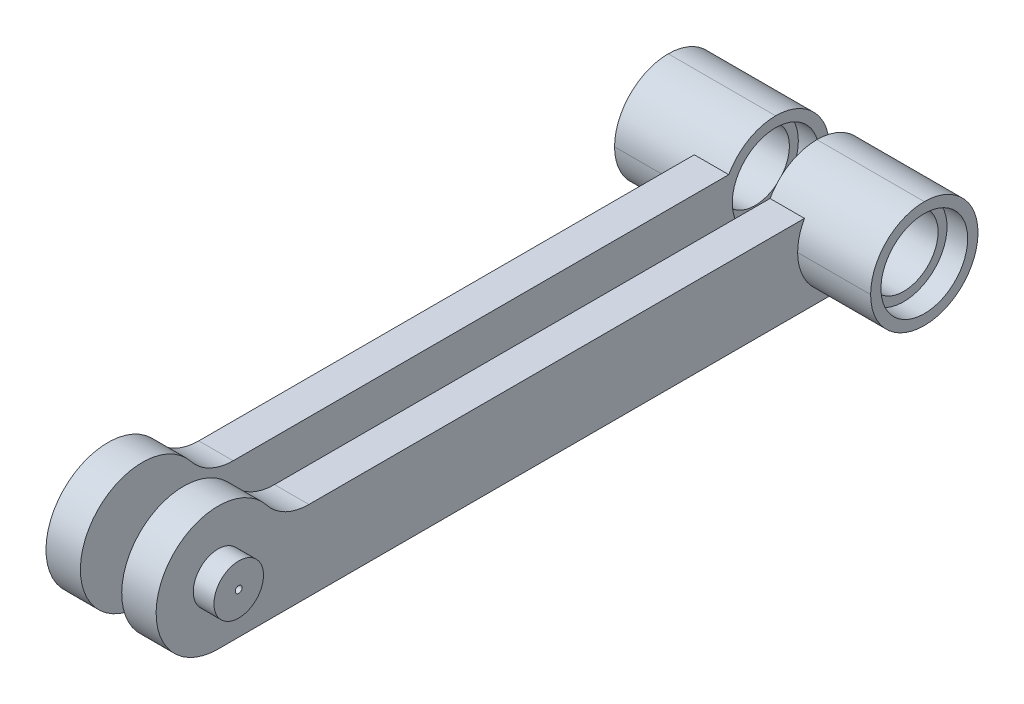
ISO-10303-21;
HEADER;
FILE_DESCRIPTION(('STEP AP214'),'2;1');
FILE_NAME('part.step','',(''),(''),'','','');
FILE_SCHEMA(('AUTOMOTIVE_DESIGN { 1 0 10303 214 1 1 1 1 }'));
ENDSEC;
DATA;
#1=APPLICATION_CONTEXT('core data for automotive mechanical design processes');
#2=APPLICATION_PROTOCOL_DEFINITION('international standard','automotive_design',2000,#1);
#3=PRODUCT_CONTEXT('',#1,'mechanical');
#4=PRODUCT('Part','Part','',(#3));
#5=PRODUCT_RELATED_PRODUCT_CATEGORY('part','',(#4));
#6=PRODUCT_DEFINITION_FORMATION('','',#4);
#7=PRODUCT_DEFINITION_CONTEXT('part definition',#1,'design');
#8=PRODUCT_DEFINITION('design','',#6,#7);
#9=PRODUCT_DEFINITION_SHAPE('','',#8);
#10=(LENGTH_UNIT() NAMED_UNIT(*) SI_UNIT(.MILLI.,.METRE.));
#11=(NAMED_UNIT(*) PLANE_ANGLE_UNIT() SI_UNIT($,.RADIAN.));
#12=(NAMED_UNIT(*) SI_UNIT($,.STERADIAN.) SOLID_ANGLE_UNIT());
#13=UNCERTAINTY_MEASURE_WITH_UNIT(LENGTH_MEASURE(1.E-05),#10,'distance_accuracy_value','');
#14=(GEOMETRIC_REPRESENTATION_CONTEXT(3) GLOBAL_UNCERTAINTY_ASSIGNED_CONTEXT((#13)) GLOBAL_UNIT_ASSIGNED_CONTEXT((#10,
#11,#12)) REPRESENTATION_CONTEXT('',''));
#15=CARTESIAN_POINT('',(0.,0.,0.));
#16=DIRECTION('',(0.,0.,1.));
#17=DIRECTION('',(1.,0.,0.));
#18=AXIS2_PLACEMENT_3D('',#15,#16,#17);
#19=CARTESIAN_POINT('',(-3.,0.,0.));
#20=DIRECTION('',(-1.,0.,0.));
#21=DIRECTION('',(0.,0.,-1.));
#22=AXIS2_PLACEMENT_3D('',#19,#20,#21);
#23=PLANE('',#22);
#24=CARTESIAN_POINT('',(-3.,-0.6,-46.));
#25=DIRECTION('',(1.,0.,0.));
#26=DIRECTION('',(0.,0.,-1.));
#27=AXIS2_PLACEMENT_3D('',#24,#25,#26);
#28=CIRCLE('',#27,3.15);
#29=CARTESIAN_POINT('',(-3.,-0.6,-49.15));
#30=VERTEX_POINT('',#29);
#31=EDGE_CURVE('E228',#30,#30,#28,.T.);
#32=ORIENTED_EDGE('',*,*,#31,.F.);
#33=EDGE_LOOP('',(#32));
#34=FACE_BOUND('',#33,.T.);
#35=DIRECTION('',(0.,0.,1.));
#36=VECTOR('',#35,1.);
#37=CARTESIAN_POINT('',(-3.,1.3,0.));
#38=LINE('',#37,#36);
#39=CARTESIAN_POINT('',(-3.,1.3,-42.5941227268147));
#40=VERTEX_POINT('',#39);
#41=CARTESIAN_POINT('',(-3.,1.3,-6.59696900098826));
#42=VERTEX_POINT('',#41);
#43=EDGE_CURVE('E214',#40,#42,#38,.T.);
#44=ORIENTED_EDGE('',*,*,#43,.T.);
#45=CARTESIAN_POINT('',(-3.,5.2,-6.59696900098826));
#46=DIRECTION('',(1.,0.,0.));
#47=DIRECTION('',(0.,0.,-1.));
#48=AXIS2_PLACEMENT_3D('',#45,#46,#47);
#49=CIRCLE('',#48,3.9);
#50=CARTESIAN_POINT('',(-3.,2.78571428571429,-3.53409053624371));
#51=VERTEX_POINT('',#50);
#52=EDGE_CURVE('E171',#51,#42,#49,.T.);
#53=ORIENTED_EDGE('',*,*,#52,.F.);
#54=CARTESIAN_POINT('',(-3.,0.,0.));
#55=DIRECTION('',(1.,0.,0.));
#56=DIRECTION('',(0.,0.,-1.));
#57=AXIS2_PLACEMENT_3D('',#54,#55,#56);
#58=CIRCLE('',#57,4.5);
#59=CARTESIAN_POINT('',(-3.,-4.5,0.));
#60=VERTEX_POINT('',#59);
#61=EDGE_CURVE('E149',#51,#60,#58,.T.);
#62=ORIENTED_EDGE('',*,*,#61,.T.);
#63=DIRECTION('',(0.,0.,-1.));
#64=VECTOR('',#63,1.);
#65=CARTESIAN_POINT('',(-3.,-4.5,0.));
#66=LINE('',#65,#64);
#67=CARTESIAN_POINT('',(-3.,-4.5,-46.));
#68=VERTEX_POINT('',#67);
#69=EDGE_CURVE('E159',#60,#68,#66,.T.);
#70=ORIENTED_EDGE('',*,*,#69,.T.);
#71=CARTESIAN_POINT('',(-3.,-0.6,-46.));
#72=DIRECTION('',(1.,0.,0.));
#73=DIRECTION('',(0.,0.,-1.));
#74=AXIS2_PLACEMENT_3D('',#71,#72,#73);
#75=CIRCLE('',#74,3.9);
#76=CARTESIAN_POINT('',(-3.,-0.6,-49.9));
#77=VERTEX_POINT('',#76);
#78=EDGE_CURVE('E198',#77,#68,#75,.F.);
#79=ORIENTED_EDGE('',*,*,#78,.F.);
#80=CARTESIAN_POINT('',(-3.,-0.6,-46.));
#81=DIRECTION('',(1.,0.,0.));
#82=DIRECTION('',(0.,0.,-1.));
#83=AXIS2_PLACEMENT_3D('',#80,#81,#82);
#84=CIRCLE('',#83,3.9);
#85=CARTESIAN_POINT('',(-3.,3.3,-46.));
#86=VERTEX_POINT('',#85);
#87=EDGE_CURVE('E195',#86,#77,#84,.F.);
#88=ORIENTED_EDGE('',*,*,#87,.F.);
#89=CARTESIAN_POINT('',(-3.,-0.6,-46.));
#90=DIRECTION('',(1.,0.,0.));
#91=DIRECTION('',(0.,0.,-1.));
#92=AXIS2_PLACEMENT_3D('',#89,#90,#91);
#93=CIRCLE('',#92,3.9);
#94=EDGE_CURVE('E200',#40,#86,#93,.F.);
#95=ORIENTED_EDGE('',*,*,#94,.F.);
#96=EDGE_LOOP('',(#44,#53,#62,#70,#79,#88,#95));
#97=FACE_BOUND('',#96,.T.);
#98=ADVANCED_FACE('F76',(#34,#97),#23,.F.);
#99=CARTESIAN_POINT('',(-5.5,0.,0.));
#100=DIRECTION('',(-1.,0.,0.));
#101=DIRECTION('',(0.,0.,-1.));
#102=AXIS2_PLACEMENT_3D('',#99,#100,#101);
#103=PLANE('',#102);
#104=CARTESIAN_POINT('',(-5.5,0.,0.));
#105=DIRECTION('',(1.,0.,0.));
#106=DIRECTION('',(0.,0.,-1.));
#107=AXIS2_PLACEMENT_3D('',#104,#105,#106);
#108=CIRCLE('',#107,1.8);
#109=CARTESIAN_POINT('',(-5.5,0.,-1.8));
#110=VERTEX_POINT('',#109);
#111=EDGE_CURVE('E242',#110,#110,#108,.T.);
#112=ORIENTED_EDGE('',*,*,#111,.T.);
#113=EDGE_LOOP('',(#112));
#114=FACE_BOUND('',#113,.T.);
#115=DIRECTION('',(0.,0.,-1.));
#116=VECTOR('',#115,1.);
#117=CARTESIAN_POINT('',(-5.5,1.3,0.));
#118=LINE('',#117,#116);
#119=CARTESIAN_POINT('',(-5.5,1.3,-6.59696900098826));
#120=VERTEX_POINT('',#119);
#121=CARTESIAN_POINT('',(-5.5,1.3,-42.5941227268147));
#122=VERTEX_POINT('',#121);
#123=EDGE_CURVE('E215',#120,#122,#118,.T.);
#124=ORIENTED_EDGE('',*,*,#123,.T.);
#125=CARTESIAN_POINT('',(-5.5,-0.6,-46.));
#126=DIRECTION('',(1.,0.,0.));
#127=DIRECTION('',(0.,0.,-1.));
#128=AXIS2_PLACEMENT_3D('',#125,#126,#127);
#129=CIRCLE('',#128,3.9);
#130=CARTESIAN_POINT('',(-5.5,-0.6,-42.1));
#131=VERTEX_POINT('',#130);
#132=EDGE_CURVE('E85',#131,#122,#129,.F.);
#133=ORIENTED_EDGE('',*,*,#132,.F.);
#134=CARTESIAN_POINT('',(-5.5,-0.6,-46.));
#135=DIRECTION('',(1.,0.,0.));
#136=DIRECTION('',(0.,0.,-1.));
#137=AXIS2_PLACEMENT_3D('',#134,#135,#136);
#138=CIRCLE('',#137,3.9);
#139=CARTESIAN_POINT('',(-5.5,-4.5,-46.));
#140=VERTEX_POINT('',#139);
#141=EDGE_CURVE('E207',#140,#131,#138,.F.);
#142=ORIENTED_EDGE('',*,*,#141,.F.);
#143=DIRECTION('',(0.,0.,-1.));
#144=VECTOR('',#143,1.);
#145=CARTESIAN_POINT('',(-5.5,-4.5,0.));
#146=LINE('',#145,#144);
#147=CARTESIAN_POINT('',(-5.5,-4.5,0.));
#148=VERTEX_POINT('',#147);
#149=EDGE_CURVE('E166',#148,#140,#146,.T.);
#150=ORIENTED_EDGE('',*,*,#149,.F.);
#151=CARTESIAN_POINT('',(-5.5,0.,0.));
#152=DIRECTION('',(1.,0.,0.));
#153=DIRECTION('',(0.,0.,-1.));
#154=AXIS2_PLACEMENT_3D('',#151,#152,#153);
#155=CIRCLE('',#154,4.5);
#156=CARTESIAN_POINT('',(-5.5,2.78571428571429,-3.53409053624371));
#157=VERTEX_POINT('',#156);
#158=EDGE_CURVE('E152',#157,#148,#155,.T.);
#159=ORIENTED_EDGE('',*,*,#158,.F.);
#160=CARTESIAN_POINT('',(-5.5,5.2,-6.59696900098826));
#161=DIRECTION('',(1.,0.,0.));
#162=DIRECTION('',(0.,0.,-1.));
#163=AXIS2_PLACEMENT_3D('',#160,#161,#162);
#164=CIRCLE('',#163,3.9);
#165=EDGE_CURVE('E204',#120,#157,#164,.F.);
#166=ORIENTED_EDGE('',*,*,#165,.F.);
#167=EDGE_LOOP('',(#124,#133,#142,#150,#159,#166));
#168=FACE_BOUND('',#167,.T.);
#169=ADVANCED_FACE('F247',(#114,#168),#103,.T.);
#170=CARTESIAN_POINT('',(-10.8,-0.6,-46.));
#171=DIRECTION('',(1.,0.,0.));
#172=DIRECTION('',(0.,0.,1.));
#173=AXIS2_PLACEMENT_3D('',#170,#171,#172);
#174=CYLINDRICAL_SURFACE('',#173,2.5);
#175=CARTESIAN_POINT('',(-4.5,-0.6,-46.));
#176=DIRECTION('',(1.,0.,0.));
#177=DIRECTION('',(0.,0.,-1.));
#178=AXIS2_PLACEMENT_3D('',#175,#176,#177);
#179=CIRCLE('',#178,2.5);
#180=CARTESIAN_POINT('',(-4.5,-0.6,-48.5));
#181=VERTEX_POINT('',#180);
#182=EDGE_CURVE('E231',#181,#181,#179,.T.);
#183=ORIENTED_EDGE('',*,*,#182,.T.);
#184=EDGE_LOOP('',(#183));
#185=FACE_BOUND('',#184,.T.);
#186=CARTESIAN_POINT('',(-9.3,-0.6,-46.));
#187=DIRECTION('',(1.,0.,0.));
#188=DIRECTION('',(0.,0.,-1.));
#189=AXIS2_PLACEMENT_3D('',#186,#187,#188);
#190=CIRCLE('',#189,2.5);
#191=CARTESIAN_POINT('',(-9.3,-0.6,-48.5));
#192=VERTEX_POINT('',#191);
#193=EDGE_CURVE('E219',#192,#192,#190,.T.);
#194=ORIENTED_EDGE('',*,*,#193,.F.);
#195=EDGE_LOOP('',(#194));
#196=FACE_BOUND('',#195,.T.);
#197=ADVANCED_FACE('F272',(#185,#196),#174,.F.);
#198=CARTESIAN_POINT('',(-5.5,0.,0.));
#199=DIRECTION('',(1.,0.,0.));
#200=DIRECTION('',(0.,0.,1.));
#201=AXIS2_PLACEMENT_3D('',#198,#199,#200);
#202=CYLINDRICAL_SURFACE('',#201,4.5);
#203=ORIENTED_EDGE('',*,*,#158,.T.);
#204=DIRECTION('',(1.,0.,0.));
#205=VECTOR('',#204,1.);
#206=CARTESIAN_POINT('',(-5.5,-4.5,0.));
#207=LINE('',#206,#205);
#208=EDGE_CURVE('E145',#148,#60,#207,.T.);
#209=ORIENTED_EDGE('',*,*,#208,.T.);
#210=ORIENTED_EDGE('',*,*,#61,.F.);
#211=DIRECTION('',(1.,0.,0.));
#212=VECTOR('',#211,1.);
#213=CARTESIAN_POINT('',(-5.5,2.78571428571429,-3.53409053624371));
#214=LINE('',#213,#212);
#215=EDGE_CURVE('E179',#157,#51,#214,.T.);
#216=ORIENTED_EDGE('',*,*,#215,.F.);
#217=EDGE_LOOP('',(#203,#209,#210,#216));
#218=FACE_BOUND('',#217,.T.);
#219=ADVANCED_FACE('F147',(#218),#202,.T.);
#220=CARTESIAN_POINT('',(-5.5,-4.5,0.));
#221=DIRECTION('',(0.,1.,0.));
#222=DIRECTION('',(0.,0.,1.));
#223=AXIS2_PLACEMENT_3D('',#220,#221,#222);
#224=PLANE('',#223);
#225=DIRECTION('',(1.,0.,0.));
#226=VECTOR('',#225,1.);
#227=CARTESIAN_POINT('',(-5.5,-4.5,-46.));
#228=LINE('',#227,#226);
#229=EDGE_CURVE('E162',#68,#140,#228,.F.);
#230=ORIENTED_EDGE('',*,*,#229,.F.);
#231=ORIENTED_EDGE('',*,*,#69,.F.);
#232=ORIENTED_EDGE('',*,*,#208,.F.);
#233=ORIENTED_EDGE('',*,*,#149,.T.);
#234=EDGE_LOOP('',(#230,#231,#232,#233));
#235=FACE_BOUND('',#234,.T.);
#236=ADVANCED_FACE('F160',(#235),#224,.F.);
#237=CARTESIAN_POINT('',(-7.,0.,0.));
#238=DIRECTION('',(-1.,0.,0.));
#239=DIRECTION('',(0.,0.,-1.));
#240=AXIS2_PLACEMENT_3D('',#237,#238,#239);
#241=PLANE('',#240);
#242=CARTESIAN_POINT('',(-7.,0.,0.));
#243=DIRECTION('',(1.,0.,0.));
#244=DIRECTION('',(0.,0.,-1.));
#245=AXIS2_PLACEMENT_3D('',#242,#243,#244);
#246=CIRCLE('',#245,1.8);
#247=CARTESIAN_POINT('',(-7.,0.,-1.8));
#248=VERTEX_POINT('',#247);
#249=EDGE_CURVE('E167',#248,#248,#246,.T.);
#250=ORIENTED_EDGE('',*,*,#249,.F.);
#251=EDGE_LOOP('',(#250));
#252=FACE_BOUND('',#251,.T.);
#253=CARTESIAN_POINT('',(-7.,0.,0.));
#254=DIRECTION('',(1.,0.,0.));
#255=DIRECTION('',(0.,0.,-1.));
#256=AXIS2_PLACEMENT_3D('',#253,#254,#255);
#257=CIRCLE('',#256,0.25);
#258=CARTESIAN_POINT('',(-7.,0.,-0.25));
#259=VERTEX_POINT('',#258);
#260=EDGE_CURVE('E237',#259,#259,#257,.T.);
#261=ORIENTED_EDGE('',*,*,#260,.T.);
#262=EDGE_LOOP('',(#261));
#263=FACE_BOUND('',#262,.T.);
#264=ADVANCED_FACE('F253',(#252,#263),#241,.T.);
#265=CARTESIAN_POINT('',(-7.,0.,0.));
#266=DIRECTION('',(1.,0.,0.));
#267=DIRECTION('',(0.,0.,1.));
#268=AXIS2_PLACEMENT_3D('',#265,#266,#267);
#269=CYLINDRICAL_SURFACE('',#268,1.8);
#270=ORIENTED_EDGE('',*,*,#249,.T.);
#271=EDGE_LOOP('',(#270));
#272=FACE_BOUND('',#271,.T.);
#273=ORIENTED_EDGE('',*,*,#111,.F.);
#274=EDGE_LOOP('',(#273));
#275=FACE_BOUND('',#274,.T.);
#276=ADVANCED_FACE('F250',(#272,#275),#269,.T.);
#277=CARTESIAN_POINT('',(-7.,0.,0.));
#278=DIRECTION('',(1.,0.,0.));
#279=DIRECTION('',(0.,0.,1.));
#280=AXIS2_PLACEMENT_3D('',#277,#278,#279);
#281=CYLINDRICAL_SURFACE('',#280,0.25);
#282=ORIENTED_EDGE('',*,*,#260,.F.);
#283=EDGE_LOOP('',(#282));
#284=FACE_BOUND('',#283,.T.);
#285=CARTESIAN_POINT('',(-5.5,0.,0.));
#286=DIRECTION('',(1.,0.,0.));
#287=DIRECTION('',(0.,0.,-1.));
#288=AXIS2_PLACEMENT_3D('',#285,#286,#287);
#289=CIRCLE('',#288,0.25);
#290=CARTESIAN_POINT('',(-5.5,0.,-0.25));
#291=VERTEX_POINT('',#290);
#292=EDGE_CURVE('E156',#291,#291,#289,.F.);
#293=ORIENTED_EDGE('',*,*,#292,.F.);
#294=EDGE_LOOP('',(#293));
#295=FACE_BOUND('',#294,.T.);
#296=ADVANCED_FACE('F252',(#284,#295),#281,.F.);
#297=ORIENTED_EDGE('',*,*,#292,.T.);
#298=EDGE_LOOP('',(#297));
#299=FACE_BOUND('',#298,.T.);
#300=ADVANCED_FACE('F260',(#299),#103,.T.);
#301=CARTESIAN_POINT('',(-10.8,0.,0.));
#302=DIRECTION('',(-1.,0.,0.));
#303=DIRECTION('',(0.,0.,-1.));
#304=AXIS2_PLACEMENT_3D('',#301,#302,#303);
#305=PLANE('',#304);
#306=CARTESIAN_POINT('',(-10.8,-0.6,-46.));
#307=DIRECTION('',(1.,0.,0.));
#308=DIRECTION('',(0.,0.,-1.));
#309=AXIS2_PLACEMENT_3D('',#306,#307,#308);
#310=CIRCLE('',#309,3.15);
#311=CARTESIAN_POINT('',(-10.8,-0.6,-49.15));
#312=VERTEX_POINT('',#311);
#313=EDGE_CURVE('E224',#312,#312,#310,.T.);
#314=ORIENTED_EDGE('',*,*,#313,.T.);
#315=EDGE_LOOP('',(#314));
#316=FACE_BOUND('',#315,.T.);
#317=CARTESIAN_POINT('',(-10.8,-0.6,-46.));
#318=DIRECTION('',(1.,0.,0.));
#319=DIRECTION('',(0.,0.,-1.));
#320=AXIS2_PLACEMENT_3D('',#317,#318,#319);
#321=CIRCLE('',#320,3.9);
#322=CARTESIAN_POINT('',(-10.8,3.3,-46.));
#323=VERTEX_POINT('',#322);
#324=CARTESIAN_POINT('',(-10.8,-0.6,-42.1));
#325=VERTEX_POINT('',#324);
#326=EDGE_CURVE('E190',#323,#325,#321,.T.);
#327=ORIENTED_EDGE('',*,*,#326,.F.);
#328=CARTESIAN_POINT('',(-10.8,-0.6,-46.));
#329=DIRECTION('',(1.,0.,0.));
#330=DIRECTION('',(0.,0.,-1.));
#331=AXIS2_PLACEMENT_3D('',#328,#329,#330);
#332=CIRCLE('',#331,3.9);
#333=CARTESIAN_POINT('',(-10.8,-0.6,-49.9));
#334=VERTEX_POINT('',#333);
#335=EDGE_CURVE('E184',#334,#323,#332,.T.);
#336=ORIENTED_EDGE('',*,*,#335,.F.);
#337=CARTESIAN_POINT('',(-10.8,-0.6,-46.));
#338=DIRECTION('',(1.,0.,0.));
#339=DIRECTION('',(0.,0.,-1.));
#340=AXIS2_PLACEMENT_3D('',#337,#338,#339);
#341=CIRCLE('',#340,3.9);
#342=CARTESIAN_POINT('',(-10.8,-4.5,-46.));
#343=VERTEX_POINT('',#342);
#344=EDGE_CURVE('E187',#343,#334,#341,.T.);
#345=ORIENTED_EDGE('',*,*,#344,.F.);
#346=CARTESIAN_POINT('',(-10.8,-0.6,-46.));
#347=DIRECTION('',(1.,0.,0.));
#348=DIRECTION('',(0.,0.,-1.));
#349=AXIS2_PLACEMENT_3D('',#346,#347,#348);
#350=CIRCLE('',#349,3.9);
#351=EDGE_CURVE('E192',#325,#343,#350,.T.);
#352=ORIENTED_EDGE('',*,*,#351,.F.);
#353=EDGE_LOOP('',(#327,#336,#345,#352));
#354=FACE_BOUND('',#353,.T.);
#355=ADVANCED_FACE('F305',(#316,#354),#305,.T.);
#356=CARTESIAN_POINT('',(-4.5,-0.6,-46.));
#357=DIRECTION('',(1.,0.,0.));
#358=DIRECTION('',(0.,0.,1.));
#359=AXIS2_PLACEMENT_3D('',#356,#357,#358);
#360=CYLINDRICAL_SURFACE('',#359,3.15);
#361=CARTESIAN_POINT('',(-4.5,-0.6,-46.));
#362=DIRECTION('',(1.,0.,0.));
#363=DIRECTION('',(0.,0.,-1.));
#364=AXIS2_PLACEMENT_3D('',#361,#362,#363);
#365=CIRCLE('',#364,3.15);
#366=CARTESIAN_POINT('',(-4.5,-0.6,-49.15));
#367=VERTEX_POINT('',#366);
#368=EDGE_CURVE('E234',#367,#367,#365,.T.);
#369=ORIENTED_EDGE('',*,*,#368,.F.);
#370=EDGE_LOOP('',(#369));
#371=FACE_BOUND('',#370,.T.);
#372=ORIENTED_EDGE('',*,*,#31,.T.);
#373=EDGE_LOOP('',(#372));
#374=FACE_BOUND('',#373,.T.);
#375=ADVANCED_FACE('F307',(#371,#374),#360,.F.);
#376=CARTESIAN_POINT('',(-4.5,0.,0.));
#377=DIRECTION('',(-1.,0.,0.));
#378=DIRECTION('',(0.,0.,-1.));
#379=AXIS2_PLACEMENT_3D('',#376,#377,#378);
#380=PLANE('',#379);
#381=ORIENTED_EDGE('',*,*,#182,.F.);
#382=EDGE_LOOP('',(#381));
#383=FACE_BOUND('',#382,.T.);
#384=ORIENTED_EDGE('',*,*,#368,.T.);
#385=EDGE_LOOP('',(#384));
#386=FACE_BOUND('',#385,.T.);
#387=ADVANCED_FACE('F314',(#383,#386),#380,.F.);
#388=CARTESIAN_POINT('',(-9.3,-0.6,-46.));
#389=DIRECTION('',(-1.,0.,0.));
#390=DIRECTION('',(0.,0.,-1.));
#391=AXIS2_PLACEMENT_3D('',#388,#389,#390);
#392=CYLINDRICAL_SURFACE('',#391,3.15);
#393=CARTESIAN_POINT('',(-9.3,-0.6,-46.));
#394=DIRECTION('',(1.,0.,0.));
#395=DIRECTION('',(0.,0.,-1.));
#396=AXIS2_PLACEMENT_3D('',#393,#394,#395);
#397=CIRCLE('',#396,3.15);
#398=CARTESIAN_POINT('',(-9.3,-0.6,-49.15));
#399=VERTEX_POINT('',#398);
#400=EDGE_CURVE('E225',#399,#399,#397,.T.);
#401=ORIENTED_EDGE('',*,*,#400,.T.);
#402=EDGE_LOOP('',(#401));
#403=FACE_BOUND('',#402,.T.);
#404=ORIENTED_EDGE('',*,*,#313,.F.);
#405=EDGE_LOOP('',(#404));
#406=FACE_BOUND('',#405,.T.);
#407=ADVANCED_FACE('F324',(#403,#406),#392,.F.);
#408=CARTESIAN_POINT('',(-9.3,-0.6,-46.));
#409=DIRECTION('',(-1.,0.,0.));
#410=DIRECTION('',(0.,0.,-1.));
#411=AXIS2_PLACEMENT_3D('',#408,#409,#410);
#412=PLANE('',#411);
#413=ORIENTED_EDGE('',*,*,#193,.T.);
#414=EDGE_LOOP('',(#413));
#415=FACE_BOUND('',#414,.T.);
#416=ORIENTED_EDGE('',*,*,#400,.F.);
#417=EDGE_LOOP('',(#416));
#418=FACE_BOUND('',#417,.T.);
#419=ADVANCED_FACE('F328',(#415,#418),#412,.T.);
#420=CARTESIAN_POINT('',(-10.8,1.3,0.));
#421=DIRECTION('',(0.,-1.,0.));
#422=DIRECTION('',(0.,0.,-1.));
#423=AXIS2_PLACEMENT_3D('',#420,#421,#422);
#424=PLANE('',#423);
#425=ORIENTED_EDGE('',*,*,#43,.F.);
#426=DIRECTION('',(1.,0.,0.));
#427=VECTOR('',#426,1.);
#428=CARTESIAN_POINT('',(-5.5,1.3,-42.5941227268147));
#429=LINE('',#428,#427);
#430=EDGE_CURVE('E13',#122,#40,#429,.T.);
#431=ORIENTED_EDGE('',*,*,#430,.F.);
#432=ORIENTED_EDGE('',*,*,#123,.F.);
#433=DIRECTION('',(-1.,0.,0.));
#434=VECTOR('',#433,1.);
#435=CARTESIAN_POINT('',(-5.5,1.3,-6.59696900098826));
#436=LINE('',#435,#434);
#437=EDGE_CURVE('E181',#42,#120,#436,.T.);
#438=ORIENTED_EDGE('',*,*,#437,.F.);
#439=EDGE_LOOP('',(#425,#431,#432,#438));
#440=FACE_BOUND('',#439,.T.);
#441=ADVANCED_FACE('F282',(#440),#424,.F.);
#442=CARTESIAN_POINT('',(-5.5,5.2,-6.59696900098826));
#443=DIRECTION('',(1.,0.,0.));
#444=DIRECTION('',(0.,0.,1.));
#445=AXIS2_PLACEMENT_3D('',#442,#443,#444);
#446=CYLINDRICAL_SURFACE('',#445,3.9);
#447=ORIENTED_EDGE('',*,*,#165,.T.);
#448=ORIENTED_EDGE('',*,*,#215,.T.);
#449=ORIENTED_EDGE('',*,*,#52,.T.);
#450=ORIENTED_EDGE('',*,*,#437,.T.);
#451=EDGE_LOOP('',(#447,#448,#449,#450));
#452=FACE_BOUND('',#451,.T.);
#453=ADVANCED_FACE('F279',(#452),#446,.F.);
#454=CARTESIAN_POINT('',(-5.5,-0.6,-46.));
#455=DIRECTION('',(-1.,0.,0.));
#456=DIRECTION('',(0.,0.,-1.));
#457=AXIS2_PLACEMENT_3D('',#454,#455,#456);
#458=CYLINDRICAL_SURFACE('',#457,3.9);
#459=DIRECTION('',(1.,0.,0.));
#460=VECTOR('',#459,1.);
#461=CARTESIAN_POINT('',(-10.8,-0.6,-49.9));
#462=LINE('',#461,#460);
#463=EDGE_CURVE('E212',#77,#334,#462,.F.);
#464=ORIENTED_EDGE('',*,*,#463,.T.);
#465=ORIENTED_EDGE('',*,*,#335,.T.);
#466=DIRECTION('',(1.,0.,0.));
#467=VECTOR('',#466,1.);
#468=CARTESIAN_POINT('',(-3.,3.3,-46.));
#469=LINE('',#468,#467);
#470=EDGE_CURVE('E80',#323,#86,#469,.T.);
#471=ORIENTED_EDGE('',*,*,#470,.T.);
#472=ORIENTED_EDGE('',*,*,#87,.T.);
#473=EDGE_LOOP('',(#464,#465,#471,#472));
#474=FACE_BOUND('',#473,.T.);
#475=ADVANCED_FACE('F78',(#474),#458,.T.);
#476=CARTESIAN_POINT('',(-10.8,-0.6,-46.));
#477=DIRECTION('',(1.,0.,0.));
#478=DIRECTION('',(0.,0.,1.));
#479=AXIS2_PLACEMENT_3D('',#476,#477,#478);
#480=CYLINDRICAL_SURFACE('',#479,3.9);
#481=ORIENTED_EDGE('',*,*,#430,.T.);
#482=ORIENTED_EDGE('',*,*,#94,.T.);
#483=ORIENTED_EDGE('',*,*,#470,.F.);
#484=ORIENTED_EDGE('',*,*,#326,.T.);
#485=DIRECTION('',(1.,0.,0.));
#486=VECTOR('',#485,1.);
#487=CARTESIAN_POINT('',(-10.8,-0.6,-42.1));
#488=LINE('',#487,#486);
#489=EDGE_CURVE('E98',#325,#131,#488,.T.);
#490=ORIENTED_EDGE('',*,*,#489,.T.);
#491=ORIENTED_EDGE('',*,*,#132,.T.);
#492=EDGE_LOOP('',(#481,#482,#483,#484,#490,#491));
#493=FACE_BOUND('',#492,.T.);
#494=ADVANCED_FACE('F290',(#493),#480,.T.);
#495=CARTESIAN_POINT('',(-5.5,-0.6,-46.));
#496=DIRECTION('',(1.,0.,0.));
#497=DIRECTION('',(0.,0.,1.));
#498=AXIS2_PLACEMENT_3D('',#495,#496,#497);
#499=CYLINDRICAL_SURFACE('',#498,3.9);
#500=ORIENTED_EDGE('',*,*,#463,.F.);
#501=ORIENTED_EDGE('',*,*,#78,.T.);
#502=ORIENTED_EDGE('',*,*,#229,.T.);
#503=DIRECTION('',(1.,0.,0.));
#504=VECTOR('',#503,1.);
#505=CARTESIAN_POINT('',(-5.5,-4.5,-46.));
#506=LINE('',#505,#504);
#507=EDGE_CURVE('E210',#140,#343,#506,.F.);
#508=ORIENTED_EDGE('',*,*,#507,.T.);
#509=ORIENTED_EDGE('',*,*,#344,.T.);
#510=EDGE_LOOP('',(#500,#501,#502,#508,#509));
#511=FACE_BOUND('',#510,.T.);
#512=ADVANCED_FACE('F287',(#511),#499,.T.);
#513=CARTESIAN_POINT('',(-5.5,-0.6,-46.));
#514=DIRECTION('',(-1.,0.,0.));
#515=DIRECTION('',(0.,0.,-1.));
#516=AXIS2_PLACEMENT_3D('',#513,#514,#515);
#517=CYLINDRICAL_SURFACE('',#516,3.9);
#518=ORIENTED_EDGE('',*,*,#351,.T.);
#519=ORIENTED_EDGE('',*,*,#507,.F.);
#520=ORIENTED_EDGE('',*,*,#141,.T.);
#521=ORIENTED_EDGE('',*,*,#489,.F.);
#522=EDGE_LOOP('',(#518,#519,#520,#521));
#523=FACE_BOUND('',#522,.T.);
#524=ADVANCED_FACE('F284',(#523),#517,.T.);
#525=CLOSED_SHELL('',(#98,#169,#197,#219,#236,#264,#276,#296,#300,#355,#375,#387,#407,#419,#441,
#453,#475,#494,#512,#524));
#526=MANIFOLD_SOLID_BREP('B2',#525);
#527=CARTESIAN_POINT('',(0.,0.,0.));
#528=DIRECTION('',(1.,0.,0.));
#529=DIRECTION('',(0.,0.,-1.));
#530=AXIS2_PLACEMENT_3D('',#527,#528,#529);
#531=PLANE('',#530);
#532=CARTESIAN_POINT('',(0.,-0.6,-46.));
#533=DIRECTION('',(1.,0.,0.));
#534=DIRECTION('',(0.,0.,-1.));
#535=AXIS2_PLACEMENT_3D('',#532,#533,#534);
#536=CIRCLE('',#535,3.15);
#537=CARTESIAN_POINT('',(0.,-0.6,-49.15));
#538=VERTEX_POINT('',#537);
#539=EDGE_CURVE('E638',#538,#538,#536,.T.);
#540=ORIENTED_EDGE('',*,*,#539,.T.);
#541=EDGE_LOOP('',(#540));
#542=FACE_BOUND('',#541,.T.);
#543=DIRECTION('',(0.,0.,1.));
#544=VECTOR('',#543,1.);
#545=CARTESIAN_POINT('',(0.,1.3,0.));
#546=LINE('',#545,#544);
#547=CARTESIAN_POINT('',(0.,1.3,-42.5941227268147));
#548=VERTEX_POINT('',#547);
#549=CARTESIAN_POINT('',(0.,1.3,-6.59696900098826));
#550=VERTEX_POINT('',#549);
#551=EDGE_CURVE('E621',#548,#550,#546,.T.);
#552=ORIENTED_EDGE('',*,*,#551,.F.);
#553=CARTESIAN_POINT('',(0.,-0.6,-46.));
#554=DIRECTION('',(1.,0.,0.));
#555=DIRECTION('',(0.,0.,-1.));
#556=AXIS2_PLACEMENT_3D('',#553,#554,#555);
#557=CIRCLE('',#556,3.9);
#558=CARTESIAN_POINT('',(0.,3.3,-46.));
#559=VERTEX_POINT('',#558);
#560=EDGE_CURVE('E603',#548,#559,#557,.F.);
#561=ORIENTED_EDGE('',*,*,#560,.T.);
#562=CARTESIAN_POINT('',(0.,-0.6,-46.));
#563=DIRECTION('',(1.,0.,0.));
#564=DIRECTION('',(0.,0.,-1.));
#565=AXIS2_PLACEMENT_3D('',#562,#563,#564);
#566=CIRCLE('',#565,3.9);
#567=CARTESIAN_POINT('',(0.,-0.6,-49.9));
#568=VERTEX_POINT('',#567);
#569=EDGE_CURVE('E600',#559,#568,#566,.F.);
#570=ORIENTED_EDGE('',*,*,#569,.T.);
#571=CARTESIAN_POINT('',(0.,-0.6,-46.));
#572=DIRECTION('',(1.,0.,0.));
#573=DIRECTION('',(0.,0.,-1.));
#574=AXIS2_PLACEMENT_3D('',#571,#572,#573);
#575=CIRCLE('',#574,3.9);
#576=CARTESIAN_POINT('',(0.,-4.5,-46.));
#577=VERTEX_POINT('',#576);
#578=EDGE_CURVE('E576',#568,#577,#575,.F.);
#579=ORIENTED_EDGE('',*,*,#578,.T.);
#580=DIRECTION('',(0.,0.,-1.));
#581=VECTOR('',#580,1.);
#582=CARTESIAN_POINT('',(0.,-4.5,0.));
#583=LINE('',#582,#581);
#584=CARTESIAN_POINT('',(0.,-4.5,0.));
#585=VERTEX_POINT('',#584);
#586=EDGE_CURVE('E571',#585,#577,#583,.T.);
#587=ORIENTED_EDGE('',*,*,#586,.F.);
#588=CARTESIAN_POINT('',(0.,0.,0.));
#589=DIRECTION('',(1.,0.,0.));
#590=DIRECTION('',(0.,0.,-1.));
#591=AXIS2_PLACEMENT_3D('',#588,#589,#590);
#592=CIRCLE('',#591,4.5);
#593=CARTESIAN_POINT('',(0.,2.78571428571429,-3.53409053624371));
#594=VERTEX_POINT('',#593);
#595=EDGE_CURVE('E554',#594,#585,#592,.T.);
#596=ORIENTED_EDGE('',*,*,#595,.F.);
#597=CARTESIAN_POINT('',(0.,5.2,-6.59696900098826));
#598=DIRECTION('',(1.,0.,0.));
#599=DIRECTION('',(0.,0.,-1.));
#600=AXIS2_PLACEMENT_3D('',#597,#598,#599);
#601=CIRCLE('',#600,3.9);
#602=EDGE_CURVE('E605',#594,#550,#601,.T.);
#603=ORIENTED_EDGE('',*,*,#602,.T.);
#604=EDGE_LOOP('',(#552,#561,#570,#579,#587,#596,#603));
#605=FACE_BOUND('',#604,.T.);
#606=ADVANCED_FACE('F481',(#542,#605),#531,.F.);
#607=CARTESIAN_POINT('',(2.5,0.,0.));
#608=DIRECTION('',(1.,0.,0.));
#609=DIRECTION('',(0.,0.,-1.));
#610=AXIS2_PLACEMENT_3D('',#607,#608,#609);
#611=PLANE('',#610);
#612=CARTESIAN_POINT('',(2.5,0.,0.));
#613=DIRECTION('',(1.,0.,0.));
#614=DIRECTION('',(0.,0.,-1.));
#615=AXIS2_PLACEMENT_3D('',#612,#613,#614);
#616=CIRCLE('',#615,1.8);
#617=CARTESIAN_POINT('',(2.5,0.,-1.8));
#618=VERTEX_POINT('',#617);
#619=EDGE_CURVE('E581',#618,#618,#616,.T.);
#620=ORIENTED_EDGE('',*,*,#619,.F.);
#621=EDGE_LOOP('',(#620));
#622=FACE_BOUND('',#621,.T.);
#623=DIRECTION('',(0.,0.,-1.));
#624=VECTOR('',#623,1.);
#625=CARTESIAN_POINT('',(2.5,1.3,0.));
#626=LINE('',#625,#624);
#627=CARTESIAN_POINT('',(2.5,1.3,-6.59696900098826));
#628=VERTEX_POINT('',#627);
#629=CARTESIAN_POINT('',(2.5,1.3,-42.5941227268147));
#630=VERTEX_POINT('',#629);
#631=EDGE_CURVE('E497',#628,#630,#626,.T.);
#632=ORIENTED_EDGE('',*,*,#631,.F.);
#633=CARTESIAN_POINT('',(2.5,5.2,-6.59696900098826));
#634=DIRECTION('',(1.,0.,0.));
#635=DIRECTION('',(0.,0.,-1.));
#636=AXIS2_PLACEMENT_3D('',#633,#634,#635);
#637=CIRCLE('',#636,3.9);
#638=CARTESIAN_POINT('',(2.5,2.78571428571429,-3.53409053624371));
#639=VERTEX_POINT('',#638);
#640=EDGE_CURVE('E607',#628,#639,#637,.F.);
#641=ORIENTED_EDGE('',*,*,#640,.T.);
#642=CARTESIAN_POINT('',(2.5,0.,0.));
#643=DIRECTION('',(1.,0.,0.));
#644=DIRECTION('',(0.,0.,-1.));
#645=AXIS2_PLACEMENT_3D('',#642,#643,#644);
#646=CIRCLE('',#645,4.5);
#647=CARTESIAN_POINT('',(2.5,-4.5,0.));
#648=VERTEX_POINT('',#647);
#649=EDGE_CURVE('E564',#639,#648,#646,.T.);
#650=ORIENTED_EDGE('',*,*,#649,.T.);
#651=DIRECTION('',(0.,0.,-1.));
#652=VECTOR('',#651,1.);
#653=CARTESIAN_POINT('',(2.5,-4.5,0.));
#654=LINE('',#653,#652);
#655=CARTESIAN_POINT('',(2.5,-4.5,-46.));
#656=VERTEX_POINT('',#655);
#657=EDGE_CURVE('E565',#648,#656,#654,.T.);
#658=ORIENTED_EDGE('',*,*,#657,.T.);
#659=CARTESIAN_POINT('',(2.5,-0.6,-46.));
#660=DIRECTION('',(1.,0.,0.));
#661=DIRECTION('',(0.,0.,-1.));
#662=AXIS2_PLACEMENT_3D('',#659,#660,#661);
#663=CIRCLE('',#662,3.9);
#664=CARTESIAN_POINT('',(2.5,-0.6,-42.1));
#665=VERTEX_POINT('',#664);
#666=EDGE_CURVE('E609',#656,#665,#663,.F.);
#667=ORIENTED_EDGE('',*,*,#666,.T.);
#668=CARTESIAN_POINT('',(2.5,-0.6,-46.));
#669=DIRECTION('',(1.,0.,0.));
#670=DIRECTION('',(0.,0.,-1.));
#671=AXIS2_PLACEMENT_3D('',#668,#669,#670);
#672=CIRCLE('',#671,3.9);
#673=EDGE_CURVE('E490',#665,#630,#672,.F.);
#674=ORIENTED_EDGE('',*,*,#673,.T.);
#675=EDGE_LOOP('',(#632,#641,#650,#658,#667,#674));
#676=FACE_BOUND('',#675,.T.);
#677=ADVANCED_FACE('F655',(#622,#676),#611,.T.);
#678=CARTESIAN_POINT('',(7.8,-0.6,-46.));
#679=DIRECTION('',(-1.,0.,0.));
#680=DIRECTION('',(0.,0.,1.));
#681=AXIS2_PLACEMENT_3D('',#678,#679,#680);
#682=CYLINDRICAL_SURFACE('',#681,2.5);
#683=CARTESIAN_POINT('',(1.5,-0.6,-46.));
#684=DIRECTION('',(1.,0.,0.));
#685=DIRECTION('',(0.,0.,-1.));
#686=AXIS2_PLACEMENT_3D('',#683,#684,#685);
#687=CIRCLE('',#686,2.5);
#688=CARTESIAN_POINT('',(1.5,-0.6,-48.5));
#689=VERTEX_POINT('',#688);
#690=EDGE_CURVE('E641',#689,#689,#687,.T.);
#691=ORIENTED_EDGE('',*,*,#690,.F.);
#692=EDGE_LOOP('',(#691));
#693=FACE_BOUND('',#692,.T.);
#694=CARTESIAN_POINT('',(6.3,-0.6,-46.));
#695=DIRECTION('',(1.,0.,0.));
#696=DIRECTION('',(0.,0.,-1.));
#697=AXIS2_PLACEMENT_3D('',#694,#695,#696);
#698=CIRCLE('',#697,2.5);
#699=CARTESIAN_POINT('',(6.3,-0.6,-48.5));
#700=VERTEX_POINT('',#699);
#701=EDGE_CURVE('E629',#700,#700,#698,.T.);
#702=ORIENTED_EDGE('',*,*,#701,.T.);
#703=EDGE_LOOP('',(#702));
#704=FACE_BOUND('',#703,.T.);
#705=ADVANCED_FACE('F678',(#693,#704),#682,.F.);
#706=CARTESIAN_POINT('',(2.5,0.,0.));
#707=DIRECTION('',(-1.,0.,0.));
#708=DIRECTION('',(0.,0.,1.));
#709=AXIS2_PLACEMENT_3D('',#706,#707,#708);
#710=CYLINDRICAL_SURFACE('',#709,4.5);
#711=ORIENTED_EDGE('',*,*,#649,.F.);
#712=DIRECTION('',(-1.,0.,0.));
#713=VECTOR('',#712,1.);
#714=CARTESIAN_POINT('',(2.5,2.78571428571429,-3.53409053624371));
#715=LINE('',#714,#713);
#716=EDGE_CURVE('E561',#639,#594,#715,.T.);
#717=ORIENTED_EDGE('',*,*,#716,.T.);
#718=ORIENTED_EDGE('',*,*,#595,.T.);
#719=DIRECTION('',(-1.,0.,0.));
#720=VECTOR('',#719,1.);
#721=CARTESIAN_POINT('',(2.5,-4.5,0.));
#722=LINE('',#721,#720);
#723=EDGE_CURVE('E558',#648,#585,#722,.T.);
#724=ORIENTED_EDGE('',*,*,#723,.F.);
#725=EDGE_LOOP('',(#711,#717,#718,#724));
#726=FACE_BOUND('',#725,.T.);
#727=ADVANCED_FACE('F557',(#726),#710,.T.);
#728=CARTESIAN_POINT('',(2.5,-4.5,0.));
#729=DIRECTION('',(0.,1.,0.));
#730=DIRECTION('',(0.,0.,1.));
#731=AXIS2_PLACEMENT_3D('',#728,#729,#730);
#732=PLANE('',#731);
#733=DIRECTION('',(-1.,0.,0.));
#734=VECTOR('',#733,1.);
#735=CARTESIAN_POINT('',(2.5,-4.5,-46.));
#736=LINE('',#735,#734);
#737=EDGE_CURVE('E589',#577,#656,#736,.F.);
#738=ORIENTED_EDGE('',*,*,#737,.T.);
#739=ORIENTED_EDGE('',*,*,#657,.F.);
#740=ORIENTED_EDGE('',*,*,#723,.T.);
#741=ORIENTED_EDGE('',*,*,#586,.T.);
#742=EDGE_LOOP('',(#738,#739,#740,#741));
#743=FACE_BOUND('',#742,.T.);
#744=ADVANCED_FACE('F570',(#743),#732,.F.);
#745=CARTESIAN_POINT('',(4.,0.,0.));
#746=DIRECTION('',(1.,0.,0.));
#747=DIRECTION('',(0.,0.,-1.));
#748=AXIS2_PLACEMENT_3D('',#745,#746,#747);
#749=PLANE('',#748);
#750=CARTESIAN_POINT('',(4.,0.,0.));
#751=DIRECTION('',(1.,0.,0.));
#752=DIRECTION('',(0.,0.,-1.));
#753=AXIS2_PLACEMENT_3D('',#750,#751,#752);
#754=CIRCLE('',#753,1.8);
#755=CARTESIAN_POINT('',(4.,0.,-1.8));
#756=VERTEX_POINT('',#755);
#757=EDGE_CURVE('E577',#756,#756,#754,.T.);
#758=ORIENTED_EDGE('',*,*,#757,.T.);
#759=EDGE_LOOP('',(#758));
#760=FACE_BOUND('',#759,.T.);
#761=CARTESIAN_POINT('',(4.,0.,0.));
#762=DIRECTION('',(1.,0.,0.));
#763=DIRECTION('',(0.,0.,-1.));
#764=AXIS2_PLACEMENT_3D('',#761,#762,#763);
#765=CIRCLE('',#764,0.25);
#766=CARTESIAN_POINT('',(4.,0.,-0.25));
#767=VERTEX_POINT('',#766);
#768=EDGE_CURVE('E647',#767,#767,#765,.T.);
#769=ORIENTED_EDGE('',*,*,#768,.F.);
#770=EDGE_LOOP('',(#769));
#771=FACE_BOUND('',#770,.T.);
#772=ADVANCED_FACE('F688',(#760,#771),#749,.T.);
#773=CARTESIAN_POINT('',(4.,0.,0.));
#774=DIRECTION('',(-1.,0.,0.));
#775=DIRECTION('',(0.,0.,1.));
#776=AXIS2_PLACEMENT_3D('',#773,#774,#775);
#777=CYLINDRICAL_SURFACE('',#776,1.8);
#778=ORIENTED_EDGE('',*,*,#757,.F.);
#779=EDGE_LOOP('',(#778));
#780=FACE_BOUND('',#779,.T.);
#781=ORIENTED_EDGE('',*,*,#619,.T.);
#782=EDGE_LOOP('',(#781));
#783=FACE_BOUND('',#782,.T.);
#784=ADVANCED_FACE('F716',(#780,#783),#777,.T.);
#785=CARTESIAN_POINT('',(4.,0.,0.));
#786=DIRECTION('',(-1.,0.,0.));
#787=DIRECTION('',(0.,0.,1.));
#788=AXIS2_PLACEMENT_3D('',#785,#786,#787);
#789=CYLINDRICAL_SURFACE('',#788,0.25);
#790=ORIENTED_EDGE('',*,*,#768,.T.);
#791=EDGE_LOOP('',(#790));
#792=FACE_BOUND('',#791,.T.);
#793=CARTESIAN_POINT('',(2.5,0.,0.));
#794=DIRECTION('',(1.,0.,0.));
#795=DIRECTION('',(0.,0.,-1.));
#796=AXIS2_PLACEMENT_3D('',#793,#794,#795);
#797=CIRCLE('',#796,0.25);
#798=CARTESIAN_POINT('',(2.5,0.,-0.25));
#799=VERTEX_POINT('',#798);
#800=EDGE_CURVE('E573',#799,#799,#797,.F.);
#801=ORIENTED_EDGE('',*,*,#800,.T.);
#802=EDGE_LOOP('',(#801));
#803=FACE_BOUND('',#802,.T.);
#804=ADVANCED_FACE('F709',(#792,#803),#789,.F.);
#805=ORIENTED_EDGE('',*,*,#800,.F.);
#806=EDGE_LOOP('',(#805));
#807=FACE_BOUND('',#806,.T.);
#808=ADVANCED_FACE('F681',(#807),#611,.T.);
#809=CARTESIAN_POINT('',(7.8,0.,0.));
#810=DIRECTION('',(1.,0.,0.));
#811=DIRECTION('',(0.,0.,-1.));
#812=AXIS2_PLACEMENT_3D('',#809,#810,#811);
#813=PLANE('',#812);
#814=CARTESIAN_POINT('',(7.8,-0.6,-46.));
#815=DIRECTION('',(1.,0.,0.));
#816=DIRECTION('',(0.,0.,-1.));
#817=AXIS2_PLACEMENT_3D('',#814,#815,#816);
#818=CIRCLE('',#817,3.15);
#819=CARTESIAN_POINT('',(7.8,-0.6,-49.15));
#820=VERTEX_POINT('',#819);
#821=EDGE_CURVE('E634',#820,#820,#818,.T.);
#822=ORIENTED_EDGE('',*,*,#821,.F.);
#823=EDGE_LOOP('',(#822));
#824=FACE_BOUND('',#823,.T.);
#825=CARTESIAN_POINT('',(7.8,-0.6,-46.));
#826=DIRECTION('',(1.,0.,0.));
#827=DIRECTION('',(0.,0.,-1.));
#828=AXIS2_PLACEMENT_3D('',#825,#826,#827);
#829=CIRCLE('',#828,3.9);
#830=CARTESIAN_POINT('',(7.8,3.3,-46.));
#831=VERTEX_POINT('',#830);
#832=CARTESIAN_POINT('',(7.8,-0.6,-42.1));
#833=VERTEX_POINT('',#832);
#834=EDGE_CURVE('E595',#831,#833,#829,.T.);
#835=ORIENTED_EDGE('',*,*,#834,.T.);
#836=CARTESIAN_POINT('',(7.8,-0.6,-46.));
#837=DIRECTION('',(1.,0.,0.));
#838=DIRECTION('',(0.,0.,-1.));
#839=AXIS2_PLACEMENT_3D('',#836,#837,#838);
#840=CIRCLE('',#839,3.9);
#841=CARTESIAN_POINT('',(7.8,-4.5,-46.));
#842=VERTEX_POINT('',#841);
#843=EDGE_CURVE('E597',#833,#842,#840,.T.);
#844=ORIENTED_EDGE('',*,*,#843,.T.);
#845=CARTESIAN_POINT('',(7.8,-0.6,-46.));
#846=DIRECTION('',(1.,0.,0.));
#847=DIRECTION('',(0.,0.,-1.));
#848=AXIS2_PLACEMENT_3D('',#845,#846,#847);
#849=CIRCLE('',#848,3.9);
#850=CARTESIAN_POINT('',(7.8,-0.6,-49.9));
#851=VERTEX_POINT('',#850);
#852=EDGE_CURVE('E593',#842,#851,#849,.T.);
#853=ORIENTED_EDGE('',*,*,#852,.T.);
#854=CARTESIAN_POINT('',(7.8,-0.6,-46.));
#855=DIRECTION('',(1.,0.,0.));
#856=DIRECTION('',(0.,0.,-1.));
#857=AXIS2_PLACEMENT_3D('',#854,#855,#856);
#858=CIRCLE('',#857,3.9);
#859=EDGE_CURVE('E591',#851,#831,#858,.T.);
#860=ORIENTED_EDGE('',*,*,#859,.T.);
#861=EDGE_LOOP('',(#835,#844,#853,#860));
#862=FACE_BOUND('',#861,.T.);
#863=ADVANCED_FACE('F696',(#824,#862),#813,.T.);
#864=CARTESIAN_POINT('',(1.5,-0.6,-46.));
#865=DIRECTION('',(-1.,0.,0.));
#866=DIRECTION('',(0.,0.,1.));
#867=AXIS2_PLACEMENT_3D('',#864,#865,#866);
#868=CYLINDRICAL_SURFACE('',#867,3.15);
#869=CARTESIAN_POINT('',(1.5,-0.6,-46.));
#870=DIRECTION('',(1.,0.,0.));
#871=DIRECTION('',(0.,0.,-1.));
#872=AXIS2_PLACEMENT_3D('',#869,#870,#871);
#873=CIRCLE('',#872,3.15);
#874=CARTESIAN_POINT('',(1.5,-0.6,-49.15));
#875=VERTEX_POINT('',#874);
#876=EDGE_CURVE('E644',#875,#875,#873,.T.);
#877=ORIENTED_EDGE('',*,*,#876,.T.);
#878=EDGE_LOOP('',(#877));
#879=FACE_BOUND('',#878,.T.);
#880=ORIENTED_EDGE('',*,*,#539,.F.);
#881=EDGE_LOOP('',(#880));
#882=FACE_BOUND('',#881,.T.);
#883=ADVANCED_FACE('F699',(#879,#882),#868,.F.);
#884=CARTESIAN_POINT('',(1.5,0.,0.));
#885=DIRECTION('',(1.,0.,0.));
#886=DIRECTION('',(0.,0.,-1.));
#887=AXIS2_PLACEMENT_3D('',#884,#885,#886);
#888=PLANE('',#887);
#889=ORIENTED_EDGE('',*,*,#690,.T.);
#890=EDGE_LOOP('',(#889));
#891=FACE_BOUND('',#890,.T.);
#892=ORIENTED_EDGE('',*,*,#876,.F.);
#893=EDGE_LOOP('',(#892));
#894=FACE_BOUND('',#893,.T.);
#895=ADVANCED_FACE('F706',(#891,#894),#888,.F.);
#896=CARTESIAN_POINT('',(6.3,-0.6,-46.));
#897=DIRECTION('',(1.,0.,0.));
#898=DIRECTION('',(0.,0.,-1.));
#899=AXIS2_PLACEMENT_3D('',#896,#897,#898);
#900=CYLINDRICAL_SURFACE('',#899,3.15);
#901=CARTESIAN_POINT('',(6.3,-0.6,-46.));
#902=DIRECTION('',(1.,0.,0.));
#903=DIRECTION('',(0.,0.,-1.));
#904=AXIS2_PLACEMENT_3D('',#901,#902,#903);
#905=CIRCLE('',#904,3.15);
#906=CARTESIAN_POINT('',(6.3,-0.6,-49.15));
#907=VERTEX_POINT('',#906);
#908=EDGE_CURVE('E635',#907,#907,#905,.T.);
#909=ORIENTED_EDGE('',*,*,#908,.F.);
#910=EDGE_LOOP('',(#909));
#911=FACE_BOUND('',#910,.T.);
#912=ORIENTED_EDGE('',*,*,#821,.T.);
#913=EDGE_LOOP('',(#912));
#914=FACE_BOUND('',#913,.T.);
#915=ADVANCED_FACE('F759',(#911,#914),#900,.F.);
#916=CARTESIAN_POINT('',(6.3,-0.6,-46.));
#917=DIRECTION('',(1.,0.,0.));
#918=DIRECTION('',(0.,0.,-1.));
#919=AXIS2_PLACEMENT_3D('',#916,#917,#918);
#920=PLANE('',#919);
#921=ORIENTED_EDGE('',*,*,#701,.F.);
#922=EDGE_LOOP('',(#921));
#923=FACE_BOUND('',#922,.T.);
#924=ORIENTED_EDGE('',*,*,#908,.T.);
#925=EDGE_LOOP('',(#924));
#926=FACE_BOUND('',#925,.T.);
#927=ADVANCED_FACE('F777',(#923,#926),#920,.T.);
#928=CARTESIAN_POINT('',(7.8,1.3,0.));
#929=DIRECTION('',(0.,-1.,0.));
#930=DIRECTION('',(0.,0.,-1.));
#931=AXIS2_PLACEMENT_3D('',#928,#929,#930);
#932=PLANE('',#931);
#933=ORIENTED_EDGE('',*,*,#551,.T.);
#934=DIRECTION('',(1.,0.,0.));
#935=VECTOR('',#934,1.);
#936=CARTESIAN_POINT('',(2.5,1.3,-6.59696900098826));
#937=LINE('',#936,#935);
#938=EDGE_CURVE('E587',#550,#628,#937,.T.);
#939=ORIENTED_EDGE('',*,*,#938,.T.);
#940=ORIENTED_EDGE('',*,*,#631,.T.);
#941=DIRECTION('',(-1.,0.,0.));
#942=VECTOR('',#941,1.);
#943=CARTESIAN_POINT('',(2.5,1.3,-42.5941227268147));
#944=LINE('',#943,#942);
#945=EDGE_CURVE('E74',#630,#548,#944,.T.);
#946=ORIENTED_EDGE('',*,*,#945,.T.);
#947=EDGE_LOOP('',(#933,#939,#940,#946));
#948=FACE_BOUND('',#947,.T.);
#949=ADVANCED_FACE('F661',(#948),#932,.F.);
#950=CARTESIAN_POINT('',(2.5,5.2,-6.59696900098826));
#951=DIRECTION('',(-1.,0.,0.));
#952=DIRECTION('',(0.,0.,1.));
#953=AXIS2_PLACEMENT_3D('',#950,#951,#952);
#954=CYLINDRICAL_SURFACE('',#953,3.9);
#955=ORIENTED_EDGE('',*,*,#640,.F.);
#956=ORIENTED_EDGE('',*,*,#938,.F.);
#957=ORIENTED_EDGE('',*,*,#602,.F.);
#958=ORIENTED_EDGE('',*,*,#716,.F.);
#959=EDGE_LOOP('',(#955,#956,#957,#958));
#960=FACE_BOUND('',#959,.T.);
#961=ADVANCED_FACE('F658',(#960),#954,.F.);
#962=CARTESIAN_POINT('',(2.5,-0.6,-46.));
#963=DIRECTION('',(1.,0.,0.));
#964=DIRECTION('',(0.,0.,-1.));
#965=AXIS2_PLACEMENT_3D('',#962,#963,#964);
#966=CYLINDRICAL_SURFACE('',#965,3.9);
#967=DIRECTION('',(-1.,0.,0.));
#968=VECTOR('',#967,1.);
#969=CARTESIAN_POINT('',(7.8,-0.6,-49.9));
#970=LINE('',#969,#968);
#971=EDGE_CURVE('E615',#568,#851,#970,.F.);
#972=ORIENTED_EDGE('',*,*,#971,.F.);
#973=ORIENTED_EDGE('',*,*,#569,.F.);
#974=DIRECTION('',(-1.,0.,0.));
#975=VECTOR('',#974,1.);
#976=CARTESIAN_POINT('',(0.,3.3,-46.));
#977=LINE('',#976,#975);
#978=EDGE_CURVE('E485',#831,#559,#977,.T.);
#979=ORIENTED_EDGE('',*,*,#978,.F.);
#980=ORIENTED_EDGE('',*,*,#859,.F.);
#981=EDGE_LOOP('',(#972,#973,#979,#980));
#982=FACE_BOUND('',#981,.T.);
#983=ADVANCED_FACE('F483',(#982),#966,.T.);
#984=CARTESIAN_POINT('',(7.8,-0.6,-46.));
#985=DIRECTION('',(-1.,0.,0.));
#986=DIRECTION('',(0.,0.,1.));
#987=AXIS2_PLACEMENT_3D('',#984,#985,#986);
#988=CYLINDRICAL_SURFACE('',#987,3.9);
#989=ORIENTED_EDGE('',*,*,#945,.F.);
#990=ORIENTED_EDGE('',*,*,#673,.F.);
#991=DIRECTION('',(-1.,0.,0.));
#992=VECTOR('',#991,1.);
#993=CARTESIAN_POINT('',(7.8,-0.6,-42.1));
#994=LINE('',#993,#992);
#995=EDGE_CURVE('E505',#833,#665,#994,.T.);
#996=ORIENTED_EDGE('',*,*,#995,.F.);
#997=ORIENTED_EDGE('',*,*,#834,.F.);
#998=ORIENTED_EDGE('',*,*,#978,.T.);
#999=ORIENTED_EDGE('',*,*,#560,.F.);
#1000=EDGE_LOOP('',(#989,#990,#996,#997,#998,#999));
#1001=FACE_BOUND('',#1000,.T.);
#1002=ADVANCED_FACE('F662',(#1001),#988,.T.);
#1003=CARTESIAN_POINT('',(2.5,-0.6,-46.));
#1004=DIRECTION('',(-1.,0.,0.));
#1005=DIRECTION('',(0.,0.,1.));
#1006=AXIS2_PLACEMENT_3D('',#1003,#1004,#1005);
#1007=CYLINDRICAL_SURFACE('',#1006,3.9);
#1008=ORIENTED_EDGE('',*,*,#971,.T.);
#1009=ORIENTED_EDGE('',*,*,#852,.F.);
#1010=DIRECTION('',(-1.,0.,0.));
#1011=VECTOR('',#1010,1.);
#1012=CARTESIAN_POINT('',(2.5,-4.5,-46.));
#1013=LINE('',#1012,#1011);
#1014=EDGE_CURVE('E613',#656,#842,#1013,.F.);
#1015=ORIENTED_EDGE('',*,*,#1014,.F.);
#1016=ORIENTED_EDGE('',*,*,#737,.F.);
#1017=ORIENTED_EDGE('',*,*,#578,.F.);
#1018=EDGE_LOOP('',(#1008,#1009,#1015,#1016,#1017));
#1019=FACE_BOUND('',#1018,.T.);
#1020=ADVANCED_FACE('F664',(#1019),#1007,.T.);
#1021=CARTESIAN_POINT('',(2.5,-0.6,-46.));
#1022=DIRECTION('',(1.,0.,0.));
#1023=DIRECTION('',(0.,0.,-1.));
#1024=AXIS2_PLACEMENT_3D('',#1021,#1022,#1023);
#1025=CYLINDRICAL_SURFACE('',#1024,3.9);
#1026=ORIENTED_EDGE('',*,*,#843,.F.);
#1027=ORIENTED_EDGE('',*,*,#995,.T.);
#1028=ORIENTED_EDGE('',*,*,#666,.F.);
#1029=ORIENTED_EDGE('',*,*,#1014,.T.);
#1030=EDGE_LOOP('',(#1026,#1027,#1028,#1029));
#1031=FACE_BOUND('',#1030,.T.);
#1032=ADVANCED_FACE('F669',(#1031),#1025,.T.);
#1033=CLOSED_SHELL('',(#606,#677,#705,#727,#744,#772,#784,#804,#808,#863,#883,#895,#915,#927,
#949,#961,#983,#1002,#1020,#1032));
#1034=MANIFOLD_SOLID_BREP('B7',#1033);
#1035=ADVANCED_BREP_SHAPE_REPRESENTATION('',(#18,#526,#1034),#14);
#1036=SHAPE_DEFINITION_REPRESENTATION(#9,#1035);
ENDSEC;
END-ISO-10303-21;
